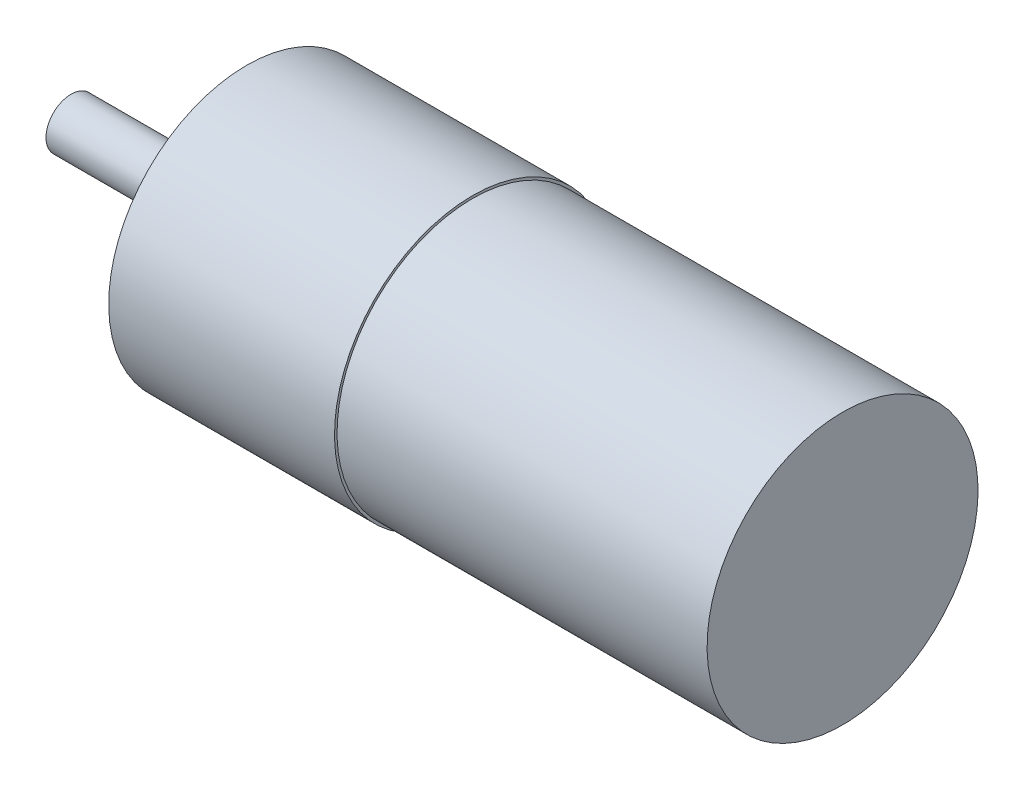
ISO-10303-21;
HEADER;
FILE_DESCRIPTION(('STEP AP214'),'2;1');
FILE_NAME('part.step','',(''),(''),'','','');
FILE_SCHEMA(('AUTOMOTIVE_DESIGN { 1 0 10303 214 1 1 1 1 }'));
ENDSEC;
DATA;
#1=APPLICATION_CONTEXT('core data for automotive mechanical design processes');
#2=APPLICATION_PROTOCOL_DEFINITION('international standard','automotive_design',2000,#1);
#3=PRODUCT_CONTEXT('',#1,'mechanical');
#4=PRODUCT('Part','Part','',(#3));
#5=PRODUCT_RELATED_PRODUCT_CATEGORY('part','',(#4));
#6=PRODUCT_DEFINITION_FORMATION('','',#4);
#7=PRODUCT_DEFINITION_CONTEXT('part definition',#1,'design');
#8=PRODUCT_DEFINITION('design','',#6,#7);
#9=PRODUCT_DEFINITION_SHAPE('','',#8);
#10=(LENGTH_UNIT() NAMED_UNIT(*) SI_UNIT(.MILLI.,.METRE.));
#11=(NAMED_UNIT(*) PLANE_ANGLE_UNIT() SI_UNIT($,.RADIAN.));
#12=(NAMED_UNIT(*) SI_UNIT($,.STERADIAN.) SOLID_ANGLE_UNIT());
#13=UNCERTAINTY_MEASURE_WITH_UNIT(LENGTH_MEASURE(1.E-05),#10,'distance_accuracy_value','');
#14=(GEOMETRIC_REPRESENTATION_CONTEXT(3) GLOBAL_UNCERTAINTY_ASSIGNED_CONTEXT((#13)) GLOBAL_UNIT_ASSIGNED_CONTEXT((#10,
#11,#12)) REPRESENTATION_CONTEXT('',''));
#15=CARTESIAN_POINT('',(0.,0.,0.));
#16=DIRECTION('',(0.,0.,1.));
#17=DIRECTION('',(1.,0.,0.));
#18=AXIS2_PLACEMENT_3D('',#15,#16,#17);
#19=CARTESIAN_POINT('',(-32.,0.,0.));
#20=DIRECTION('',(1.,0.,0.));
#21=DIRECTION('',(0.,1.,0.));
#22=AXIS2_PLACEMENT_3D('',#19,#20,#21);
#23=PLANE('',#22);
#24=CARTESIAN_POINT('',(-32.,0.,0.));
#25=DIRECTION('',(1.,0.,0.));
#26=DIRECTION('',(0.,1.,0.));
#27=AXIS2_PLACEMENT_3D('',#24,#25,#26);
#28=CIRCLE('',#27,2.);
#29=CARTESIAN_POINT('',(-32.,2.,0.));
#30=VERTEX_POINT('',#29);
#31=EDGE_CURVE('E11',#30,#30,#28,.T.);
#32=ORIENTED_EDGE('',*,*,#31,.F.);
#33=EDGE_LOOP('',(#32));
#34=FACE_BOUND('',#33,.T.);
#35=ADVANCED_FACE('F37',(#34),#23,.F.);
#36=CARTESIAN_POINT('',(0.,0.,0.));
#37=DIRECTION('',(1.,0.,0.));
#38=DIRECTION('',(0.,1.,0.));
#39=AXIS2_PLACEMENT_3D('',#36,#37,#38);
#40=CYLINDRICAL_SURFACE('',#39,2.);
#41=ORIENTED_EDGE('',*,*,#31,.T.);
#42=EDGE_LOOP('',(#41));
#43=FACE_BOUND('',#42,.T.);
#44=CARTESIAN_POINT('',(-20.,0.,0.));
#45=DIRECTION('',(1.,0.,0.));
#46=DIRECTION('',(0.,1.,0.));
#47=AXIS2_PLACEMENT_3D('',#44,#45,#46);
#48=CIRCLE('',#47,2.);
#49=CARTESIAN_POINT('',(-20.,2.,0.));
#50=VERTEX_POINT('',#49);
#51=EDGE_CURVE('E44',#50,#50,#48,.T.);
#52=ORIENTED_EDGE('',*,*,#51,.F.);
#53=EDGE_LOOP('',(#52));
#54=FACE_BOUND('',#53,.T.);
#55=ADVANCED_FACE('F112',(#43,#54),#40,.T.);
#56=CARTESIAN_POINT('',(-20.,0.,0.));
#57=DIRECTION('',(1.,0.,0.));
#58=DIRECTION('',(0.,1.,0.));
#59=AXIS2_PLACEMENT_3D('',#56,#57,#58);
#60=PLANE('',#59);
#61=CARTESIAN_POINT('',(-20.,0.,0.));
#62=DIRECTION('',(1.,0.,0.));
#63=DIRECTION('',(0.,1.,0.));
#64=AXIS2_PLACEMENT_3D('',#61,#62,#63);
#65=CIRCLE('',#64,7.);
#66=CARTESIAN_POINT('',(-20.,7.,0.));
#67=VERTEX_POINT('',#66);
#68=EDGE_CURVE('E105',#67,#67,#65,.T.);
#69=ORIENTED_EDGE('',*,*,#68,.F.);
#70=EDGE_LOOP('',(#69));
#71=FACE_BOUND('',#70,.T.);
#72=ORIENTED_EDGE('',*,*,#51,.T.);
#73=EDGE_LOOP('',(#72));
#74=FACE_BOUND('',#73,.T.);
#75=ADVANCED_FACE('F110',(#71,#74),#60,.F.);
#76=CARTESIAN_POINT('',(0.,0.,0.));
#77=DIRECTION('',(1.,0.,0.));
#78=DIRECTION('',(0.,1.,0.));
#79=AXIS2_PLACEMENT_3D('',#76,#77,#78);
#80=CYLINDRICAL_SURFACE('',#79,7.);
#81=ORIENTED_EDGE('',*,*,#68,.T.);
#82=EDGE_LOOP('',(#81));
#83=FACE_BOUND('',#82,.T.);
#84=CARTESIAN_POINT('',(-18.,0.,0.));
#85=DIRECTION('',(1.,0.,0.));
#86=DIRECTION('',(0.,1.,0.));
#87=AXIS2_PLACEMENT_3D('',#84,#85,#86);
#88=CIRCLE('',#87,7.);
#89=CARTESIAN_POINT('',(-18.,7.,0.));
#90=VERTEX_POINT('',#89);
#91=EDGE_CURVE('E102',#90,#90,#88,.T.);
#92=ORIENTED_EDGE('',*,*,#91,.F.);
#93=EDGE_LOOP('',(#92));
#94=FACE_BOUND('',#93,.T.);
#95=ADVANCED_FACE('F119',(#83,#94),#80,.T.);
#96=CARTESIAN_POINT('',(-18.,0.,0.));
#97=DIRECTION('',(1.,0.,0.));
#98=DIRECTION('',(0.,1.,0.));
#99=AXIS2_PLACEMENT_3D('',#96,#97,#98);
#100=PLANE('',#99);
#101=CARTESIAN_POINT('',(-18.,0.,-9.));
#102=DIRECTION('',(-1.,0.,0.));
#103=DIRECTION('',(0.,0.,1.));
#104=AXIS2_PLACEMENT_3D('',#101,#102,#103);
#105=CIRCLE('',#104,0.999999999999989);
#106=CARTESIAN_POINT('',(-18.,0.,-8.00000000000001));
#107=VERTEX_POINT('',#106);
#108=EDGE_CURVE('E68',#107,#107,#105,.T.);
#109=ORIENTED_EDGE('',*,*,#108,.F.);
#110=EDGE_LOOP('',(#109));
#111=FACE_BOUND('',#110,.T.);
#112=CARTESIAN_POINT('',(-18.,9.,0.));
#113=DIRECTION('',(-1.,0.,0.));
#114=DIRECTION('',(0.,0.,1.));
#115=AXIS2_PLACEMENT_3D('',#112,#113,#114);
#116=CIRCLE('',#115,0.999999999999989);
#117=CARTESIAN_POINT('',(-18.,9.,0.999999999999989));
#118=VERTEX_POINT('',#117);
#119=EDGE_CURVE('E67',#118,#118,#116,.T.);
#120=ORIENTED_EDGE('',*,*,#119,.F.);
#121=EDGE_LOOP('',(#120));
#122=FACE_BOUND('',#121,.T.);
#123=CARTESIAN_POINT('',(-18.,0.,9.));
#124=DIRECTION('',(-1.,0.,0.));
#125=DIRECTION('',(0.,0.,1.));
#126=AXIS2_PLACEMENT_3D('',#123,#124,#125);
#127=CIRCLE('',#126,0.999999999999989);
#128=CARTESIAN_POINT('',(-18.,0.,9.99999999999999));
#129=VERTEX_POINT('',#128);
#130=EDGE_CURVE('E78',#129,#129,#127,.T.);
#131=ORIENTED_EDGE('',*,*,#130,.F.);
#132=EDGE_LOOP('',(#131));
#133=FACE_BOUND('',#132,.T.);
#134=CARTESIAN_POINT('',(-18.,-9.,0.));
#135=DIRECTION('',(-1.,0.,0.));
#136=DIRECTION('',(0.,0.,1.));
#137=AXIS2_PLACEMENT_3D('',#134,#135,#136);
#138=CIRCLE('',#137,0.999999999999989);
#139=CARTESIAN_POINT('',(-18.,-9.,0.999999999999989));
#140=VERTEX_POINT('',#139);
#141=EDGE_CURVE('E84',#140,#140,#138,.T.);
#142=ORIENTED_EDGE('',*,*,#141,.F.);
#143=EDGE_LOOP('',(#142));
#144=FACE_BOUND('',#143,.T.);
#145=CARTESIAN_POINT('',(-18.,0.,0.));
#146=DIRECTION('',(1.,0.,0.));
#147=DIRECTION('',(0.,1.,0.));
#148=AXIS2_PLACEMENT_3D('',#145,#146,#147);
#149=CIRCLE('',#148,11.);
#150=CARTESIAN_POINT('',(-18.,11.,0.));
#151=VERTEX_POINT('',#150);
#152=EDGE_CURVE('E99',#151,#151,#149,.T.);
#153=ORIENTED_EDGE('',*,*,#152,.F.);
#154=EDGE_LOOP('',(#153));
#155=FACE_BOUND('',#154,.T.);
#156=ORIENTED_EDGE('',*,*,#91,.T.);
#157=EDGE_LOOP('',(#156));
#158=FACE_BOUND('',#157,.T.);
#159=ADVANCED_FACE('F126',(#111,#122,#133,#144,#155,#158),#100,.F.);
#160=CARTESIAN_POINT('',(0.,0.,0.));
#161=DIRECTION('',(1.,0.,0.));
#162=DIRECTION('',(0.,1.,0.));
#163=AXIS2_PLACEMENT_3D('',#160,#161,#162);
#164=CYLINDRICAL_SURFACE('',#163,11.);
#165=ORIENTED_EDGE('',*,*,#152,.T.);
#166=EDGE_LOOP('',(#165));
#167=FACE_BOUND('',#166,.T.);
#168=CARTESIAN_POINT('',(0.,0.,0.));
#169=DIRECTION('',(1.,0.,0.));
#170=DIRECTION('',(0.,1.,0.));
#171=AXIS2_PLACEMENT_3D('',#168,#169,#170);
#172=CIRCLE('',#171,11.);
#173=CARTESIAN_POINT('',(0.,11.,0.));
#174=VERTEX_POINT('',#173);
#175=EDGE_CURVE('E96',#174,#174,#172,.T.);
#176=ORIENTED_EDGE('',*,*,#175,.F.);
#177=EDGE_LOOP('',(#176));
#178=FACE_BOUND('',#177,.T.);
#179=ADVANCED_FACE('F130',(#167,#178),#164,.T.);
#180=CARTESIAN_POINT('',(0.,0.,0.));
#181=DIRECTION('',(1.,0.,0.));
#182=DIRECTION('',(0.,1.,0.));
#183=AXIS2_PLACEMENT_3D('',#180,#181,#182);
#184=PLANE('',#183);
#185=ORIENTED_EDGE('',*,*,#175,.T.);
#186=EDGE_LOOP('',(#185));
#187=FACE_BOUND('',#186,.T.);
#188=CARTESIAN_POINT('',(0.,0.,0.));
#189=DIRECTION('',(1.,0.,0.));
#190=DIRECTION('',(0.,1.,0.));
#191=AXIS2_PLACEMENT_3D('',#188,#189,#190);
#192=CIRCLE('',#191,10.8);
#193=CARTESIAN_POINT('',(0.,10.8,0.));
#194=VERTEX_POINT('',#193);
#195=EDGE_CURVE('E93',#194,#194,#192,.T.);
#196=ORIENTED_EDGE('',*,*,#195,.F.);
#197=EDGE_LOOP('',(#196));
#198=FACE_BOUND('',#197,.T.);
#199=ADVANCED_FACE('F134',(#187,#198),#184,.T.);
#200=CARTESIAN_POINT('',(0.,0.,0.));
#201=DIRECTION('',(1.,0.,0.));
#202=DIRECTION('',(0.,1.,0.));
#203=AXIS2_PLACEMENT_3D('',#200,#201,#202);
#204=CYLINDRICAL_SURFACE('',#203,10.8);
#205=CARTESIAN_POINT('',(29.5,0.,0.));
#206=DIRECTION('',(1.,0.,0.));
#207=DIRECTION('',(0.,1.,0.));
#208=AXIS2_PLACEMENT_3D('',#205,#206,#207);
#209=CIRCLE('',#208,10.8);
#210=CARTESIAN_POINT('',(29.5,10.8,0.));
#211=VERTEX_POINT('',#210);
#212=EDGE_CURVE('E90',#211,#211,#209,.T.);
#213=ORIENTED_EDGE('',*,*,#212,.F.);
#214=EDGE_LOOP('',(#213));
#215=FACE_BOUND('',#214,.T.);
#216=ORIENTED_EDGE('',*,*,#195,.T.);
#217=EDGE_LOOP('',(#216));
#218=FACE_BOUND('',#217,.T.);
#219=ADVANCED_FACE('F138',(#215,#218),#204,.T.);
#220=CARTESIAN_POINT('',(29.5,0.,0.));
#221=DIRECTION('',(1.,0.,0.));
#222=DIRECTION('',(0.,1.,0.));
#223=AXIS2_PLACEMENT_3D('',#220,#221,#222);
#224=PLANE('',#223);
#225=ORIENTED_EDGE('',*,*,#212,.T.);
#226=EDGE_LOOP('',(#225));
#227=FACE_BOUND('',#226,.T.);
#228=ADVANCED_FACE('F142',(#227),#224,.T.);
#229=CARTESIAN_POINT('',(-17.6,-9.,0.));
#230=DIRECTION('',(-1.,0.,0.));
#231=DIRECTION('',(0.,0.,1.));
#232=AXIS2_PLACEMENT_3D('',#229,#230,#231);
#233=CONICAL_SURFACE('',#232,0.999999999999999,1.02974425867665);
#234=CARTESIAN_POINT('',(-16.9991393809724,-9.,0.));
#235=VERTEX_POINT('',#234);
#236=VERTEX_LOOP('',#235);
#237=FACE_BOUND('',#236,.T.);
#238=CARTESIAN_POINT('',(-17.6,-9.,0.));
#239=DIRECTION('',(-1.,0.,0.));
#240=DIRECTION('',(0.,0.,1.));
#241=AXIS2_PLACEMENT_3D('',#238,#239,#240);
#242=CIRCLE('',#241,0.999999999999999);
#243=CARTESIAN_POINT('',(-17.6,-9.,0.999999999999999));
#244=VERTEX_POINT('',#243);
#245=EDGE_CURVE('E87',#244,#244,#242,.T.);
#246=ORIENTED_EDGE('',*,*,#245,.T.);
#247=EDGE_LOOP('',(#246));
#248=FACE_BOUND('',#247,.T.);
#249=ADVANCED_FACE('F146',(#237,#248),#233,.F.);
#250=CARTESIAN_POINT('',(-18.,-9.,0.));
#251=DIRECTION('',(-1.,0.,0.));
#252=DIRECTION('',(0.,0.,1.));
#253=AXIS2_PLACEMENT_3D('',#250,#251,#252);
#254=CYLINDRICAL_SURFACE('',#253,0.999999999999994);
#255=ORIENTED_EDGE('',*,*,#245,.F.);
#256=EDGE_LOOP('',(#255));
#257=FACE_BOUND('',#256,.T.);
#258=ORIENTED_EDGE('',*,*,#141,.T.);
#259=EDGE_LOOP('',(#258));
#260=FACE_BOUND('',#259,.T.);
#261=ADVANCED_FACE('F150',(#257,#260),#254,.F.);
#262=CARTESIAN_POINT('',(-17.6,0.,9.));
#263=DIRECTION('',(-1.,0.,0.));
#264=DIRECTION('',(0.,0.,1.));
#265=AXIS2_PLACEMENT_3D('',#262,#263,#264);
#266=CONICAL_SURFACE('',#265,1.,1.02974425867665);
#267=CARTESIAN_POINT('',(-16.9991393809724,0.,9.));
#268=VERTEX_POINT('',#267);
#269=VERTEX_LOOP('',#268);
#270=FACE_BOUND('',#269,.T.);
#271=CARTESIAN_POINT('',(-17.6,0.,9.));
#272=DIRECTION('',(-1.,0.,0.));
#273=DIRECTION('',(0.,0.,1.));
#274=AXIS2_PLACEMENT_3D('',#271,#272,#273);
#275=CIRCLE('',#274,1.);
#276=CARTESIAN_POINT('',(-17.6,0.,10.));
#277=VERTEX_POINT('',#276);
#278=EDGE_CURVE('E81',#277,#277,#275,.T.);
#279=ORIENTED_EDGE('',*,*,#278,.T.);
#280=EDGE_LOOP('',(#279));
#281=FACE_BOUND('',#280,.T.);
#282=ADVANCED_FACE('F153',(#270,#281),#266,.F.);
#283=CARTESIAN_POINT('',(-18.,0.,9.));
#284=DIRECTION('',(-1.,0.,0.));
#285=DIRECTION('',(0.,0.,1.));
#286=AXIS2_PLACEMENT_3D('',#283,#284,#285);
#287=CYLINDRICAL_SURFACE('',#286,0.999999999999994);
#288=ORIENTED_EDGE('',*,*,#278,.F.);
#289=EDGE_LOOP('',(#288));
#290=FACE_BOUND('',#289,.T.);
#291=ORIENTED_EDGE('',*,*,#130,.T.);
#292=EDGE_LOOP('',(#291));
#293=FACE_BOUND('',#292,.T.);
#294=ADVANCED_FACE('F157',(#290,#293),#287,.F.);
#295=CARTESIAN_POINT('',(-17.6,9.,0.));
#296=DIRECTION('',(-1.,0.,0.));
#297=DIRECTION('',(0.,0.,1.));
#298=AXIS2_PLACEMENT_3D('',#295,#296,#297);
#299=CONICAL_SURFACE('',#298,0.999999999999999,1.02974425867665);
#300=CARTESIAN_POINT('',(-16.9991393809724,9.,0.));
#301=VERTEX_POINT('',#300);
#302=VERTEX_LOOP('',#301);
#303=FACE_BOUND('',#302,.T.);
#304=CARTESIAN_POINT('',(-17.6,9.,0.));
#305=DIRECTION('',(-1.,0.,0.));
#306=DIRECTION('',(0.,0.,1.));
#307=AXIS2_PLACEMENT_3D('',#304,#305,#306);
#308=CIRCLE('',#307,0.999999999999999);
#309=CARTESIAN_POINT('',(-17.6,9.,0.999999999999999));
#310=VERTEX_POINT('',#309);
#311=EDGE_CURVE('E71',#310,#310,#308,.T.);
#312=ORIENTED_EDGE('',*,*,#311,.T.);
#313=EDGE_LOOP('',(#312));
#314=FACE_BOUND('',#313,.T.);
#315=ADVANCED_FACE('F160',(#303,#314),#299,.F.);
#316=CARTESIAN_POINT('',(-18.,9.,0.));
#317=DIRECTION('',(-1.,0.,0.));
#318=DIRECTION('',(0.,0.,1.));
#319=AXIS2_PLACEMENT_3D('',#316,#317,#318);
#320=CYLINDRICAL_SURFACE('',#319,0.999999999999994);
#321=ORIENTED_EDGE('',*,*,#311,.F.);
#322=EDGE_LOOP('',(#321));
#323=FACE_BOUND('',#322,.T.);
#324=ORIENTED_EDGE('',*,*,#119,.T.);
#325=EDGE_LOOP('',(#324));
#326=FACE_BOUND('',#325,.T.);
#327=ADVANCED_FACE('F61',(#323,#326),#320,.F.);
#328=CARTESIAN_POINT('',(-17.6,0.,-9.));
#329=DIRECTION('',(-1.,0.,0.));
#330=DIRECTION('',(0.,0.,1.));
#331=AXIS2_PLACEMENT_3D('',#328,#329,#330);
#332=CONICAL_SURFACE('',#331,1.,1.02974425867665);
#333=CARTESIAN_POINT('',(-16.9991393809724,0.,-9.));
#334=VERTEX_POINT('',#333);
#335=VERTEX_LOOP('',#334);
#336=FACE_BOUND('',#335,.T.);
#337=CARTESIAN_POINT('',(-17.6,0.,-9.));
#338=DIRECTION('',(-1.,0.,0.));
#339=DIRECTION('',(0.,0.,1.));
#340=AXIS2_PLACEMENT_3D('',#337,#338,#339);
#341=CIRCLE('',#340,1.);
#342=CARTESIAN_POINT('',(-17.6,0.,-8.));
#343=VERTEX_POINT('',#342);
#344=EDGE_CURVE('E65',#343,#343,#341,.T.);
#345=ORIENTED_EDGE('',*,*,#344,.T.);
#346=EDGE_LOOP('',(#345));
#347=FACE_BOUND('',#346,.T.);
#348=ADVANCED_FACE('F57',(#336,#347),#332,.F.);
#349=CARTESIAN_POINT('',(-18.,0.,-9.));
#350=DIRECTION('',(-1.,0.,0.));
#351=DIRECTION('',(0.,0.,1.));
#352=AXIS2_PLACEMENT_3D('',#349,#350,#351);
#353=CYLINDRICAL_SURFACE('',#352,0.999999999999994);
#354=ORIENTED_EDGE('',*,*,#344,.F.);
#355=EDGE_LOOP('',(#354));
#356=FACE_BOUND('',#355,.T.);
#357=ORIENTED_EDGE('',*,*,#108,.T.);
#358=EDGE_LOOP('',(#357));
#359=FACE_BOUND('',#358,.T.);
#360=ADVANCED_FACE('F60',(#356,#359),#353,.F.);
#361=CLOSED_SHELL('',(#35,#55,#75,#95,#159,#179,#199,#219,#228,#249,#261,#282,#294,#315,#327,
#348,#360));
#362=MANIFOLD_SOLID_BREP('B2',#361);
#363=ADVANCED_BREP_SHAPE_REPRESENTATION('',(#18,#362),#14);
#364=SHAPE_DEFINITION_REPRESENTATION(#9,#363);
ENDSEC;
END-ISO-10303-21;
